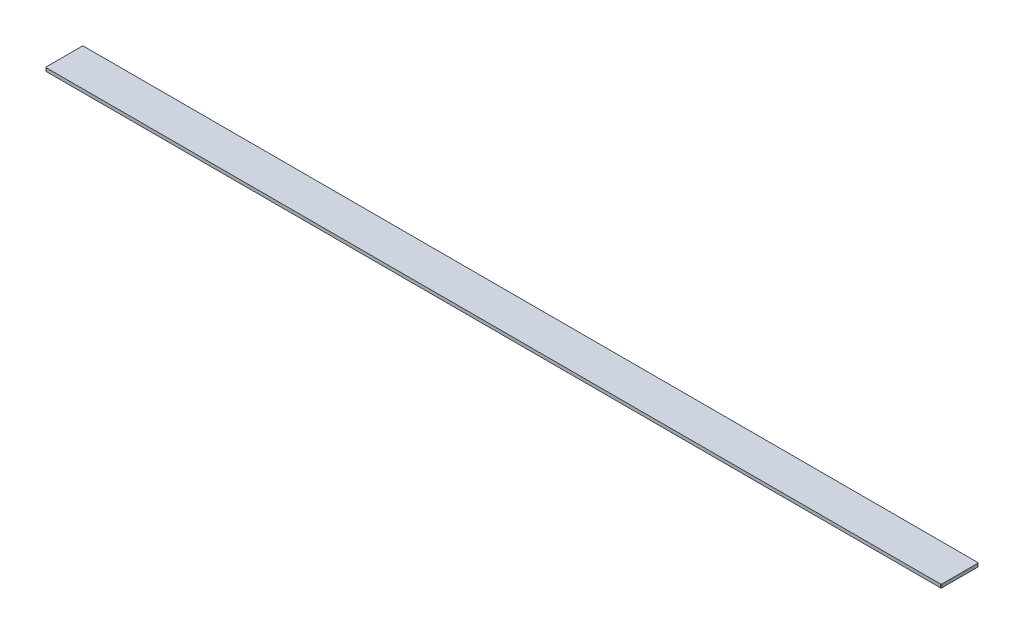
ISO-10303-21;
HEADER;
FILE_DESCRIPTION(('STEP AP214'),'2;1');
FILE_NAME('part.step','',(''),(''),'','','');
FILE_SCHEMA(('AUTOMOTIVE_DESIGN { 1 0 10303 214 1 1 1 1 }'));
ENDSEC;
DATA;
#1=APPLICATION_CONTEXT('core data for automotive mechanical design processes');
#2=APPLICATION_PROTOCOL_DEFINITION('international standard','automotive_design',2000,#1);
#3=PRODUCT_CONTEXT('',#1,'mechanical');
#4=PRODUCT('Part','Part','',(#3));
#5=PRODUCT_RELATED_PRODUCT_CATEGORY('part','',(#4));
#6=PRODUCT_DEFINITION_FORMATION('','',#4);
#7=PRODUCT_DEFINITION_CONTEXT('part definition',#1,'design');
#8=PRODUCT_DEFINITION('design','',#6,#7);
#9=PRODUCT_DEFINITION_SHAPE('','',#8);
#10=(LENGTH_UNIT() NAMED_UNIT(*) SI_UNIT(.MILLI.,.METRE.));
#11=(NAMED_UNIT(*) PLANE_ANGLE_UNIT() SI_UNIT($,.RADIAN.));
#12=(NAMED_UNIT(*) SI_UNIT($,.STERADIAN.) SOLID_ANGLE_UNIT());
#13=UNCERTAINTY_MEASURE_WITH_UNIT(LENGTH_MEASURE(1.E-05),#10,'distance_accuracy_value','');
#14=(GEOMETRIC_REPRESENTATION_CONTEXT(3) GLOBAL_UNCERTAINTY_ASSIGNED_CONTEXT((#13)) GLOBAL_UNIT_ASSIGNED_CONTEXT((#10,
#11,#12)) REPRESENTATION_CONTEXT('',''));
#15=CARTESIAN_POINT('',(0.,0.,0.));
#16=DIRECTION('',(0.,0.,1.));
#17=DIRECTION('',(1.,0.,0.));
#18=AXIS2_PLACEMENT_3D('',#15,#16,#17);
#19=CARTESIAN_POINT('',(-270.,2.,-11.25));
#20=DIRECTION('',(1.,0.,0.));
#21=DIRECTION('',(0.,0.,1.));
#22=AXIS2_PLACEMENT_3D('',#19,#20,#21);
#23=PLANE('',#22);
#24=DIRECTION('',(0.,0.,-1.));
#25=VECTOR('',#24,1.);
#26=CARTESIAN_POINT('',(-270.,2.,-11.25));
#27=LINE('',#26,#25);
#28=CARTESIAN_POINT('',(-270.,2.,10.75));
#29=VERTEX_POINT('',#28);
#30=CARTESIAN_POINT('',(-270.,2.,-10.75));
#31=VERTEX_POINT('',#30);
#32=EDGE_CURVE('E141',#29,#31,#27,.T.);
#33=ORIENTED_EDGE('',*,*,#32,.T.);
#34=DIRECTION('',(0.,-1.,0.));
#35=VECTOR('',#34,1.);
#36=CARTESIAN_POINT('',(-270.,2.,-10.75));
#37=LINE('',#36,#35);
#38=CARTESIAN_POINT('',(-270.,0.,-10.75));
#39=VERTEX_POINT('',#38);
#40=EDGE_CURVE('E125',#39,#31,#37,.F.);
#41=ORIENTED_EDGE('',*,*,#40,.F.);
#42=DIRECTION('',(0.,0.,-1.));
#43=VECTOR('',#42,1.);
#44=CARTESIAN_POINT('',(-270.,0.,-11.25));
#45=LINE('',#44,#43);
#46=CARTESIAN_POINT('',(-270.,0.,10.75));
#47=VERTEX_POINT('',#46);
#48=EDGE_CURVE('E107',#47,#39,#45,.T.);
#49=ORIENTED_EDGE('',*,*,#48,.F.);
#50=DIRECTION('',(0.,-1.,0.));
#51=VECTOR('',#50,1.);
#52=CARTESIAN_POINT('',(-270.,2.,10.75));
#53=LINE('',#52,#51);
#54=EDGE_CURVE('E118',#29,#47,#53,.T.);
#55=ORIENTED_EDGE('',*,*,#54,.F.);
#56=EDGE_LOOP('',(#33,#41,#49,#55));
#57=FACE_BOUND('',#56,.T.);
#58=ADVANCED_FACE('F38',(#57),#23,.F.);
#59=CARTESIAN_POINT('',(270.,2.,-11.25));
#60=DIRECTION('',(0.,0.,1.));
#61=DIRECTION('',(-1.,0.,0.));
#62=AXIS2_PLACEMENT_3D('',#59,#60,#61);
#63=PLANE('',#62);
#64=DIRECTION('',(1.,0.,0.));
#65=VECTOR('',#64,1.);
#66=CARTESIAN_POINT('',(270.,0.,-11.25));
#67=LINE('',#66,#65);
#68=CARTESIAN_POINT('',(-269.5,0.,-11.25));
#69=VERTEX_POINT('',#68);
#70=CARTESIAN_POINT('',(269.5,0.,-11.25));
#71=VERTEX_POINT('',#70);
#72=EDGE_CURVE('E128',#69,#71,#67,.T.);
#73=ORIENTED_EDGE('',*,*,#72,.F.);
#74=DIRECTION('',(0.,-1.,0.));
#75=VECTOR('',#74,1.);
#76=CARTESIAN_POINT('',(-269.5,2.,-11.25));
#77=LINE('',#76,#75);
#78=CARTESIAN_POINT('',(-269.5,2.,-11.25));
#79=VERTEX_POINT('',#78);
#80=EDGE_CURVE('E46',#79,#69,#77,.T.);
#81=ORIENTED_EDGE('',*,*,#80,.F.);
#82=DIRECTION('',(1.,0.,0.));
#83=VECTOR('',#82,1.);
#84=CARTESIAN_POINT('',(270.,2.,-11.25));
#85=LINE('',#84,#83);
#86=CARTESIAN_POINT('',(269.5,2.,-11.25));
#87=VERTEX_POINT('',#86);
#88=EDGE_CURVE('E162',#79,#87,#85,.T.);
#89=ORIENTED_EDGE('',*,*,#88,.T.);
#90=DIRECTION('',(0.,-1.,0.));
#91=VECTOR('',#90,1.);
#92=CARTESIAN_POINT('',(269.5,2.,-11.25));
#93=LINE('',#92,#91);
#94=EDGE_CURVE('E12',#71,#87,#93,.F.);
#95=ORIENTED_EDGE('',*,*,#94,.F.);
#96=EDGE_LOOP('',(#73,#81,#89,#95));
#97=FACE_BOUND('',#96,.T.);
#98=ADVANCED_FACE('F192',(#97),#63,.F.);
#99=CARTESIAN_POINT('',(270.,2.,-11.25));
#100=DIRECTION('',(-1.,0.,0.));
#101=DIRECTION('',(0.,0.,-1.));
#102=AXIS2_PLACEMENT_3D('',#99,#100,#101);
#103=PLANE('',#102);
#104=DIRECTION('',(0.,0.,1.));
#105=VECTOR('',#104,1.);
#106=CARTESIAN_POINT('',(270.,0.,-11.25));
#107=LINE('',#106,#105);
#108=CARTESIAN_POINT('',(270.,0.,-10.75));
#109=VERTEX_POINT('',#108);
#110=CARTESIAN_POINT('',(270.,0.,10.75));
#111=VERTEX_POINT('',#110);
#112=EDGE_CURVE('E131',#109,#111,#107,.T.);
#113=ORIENTED_EDGE('',*,*,#112,.F.);
#114=DIRECTION('',(0.,-1.,0.));
#115=VECTOR('',#114,1.);
#116=CARTESIAN_POINT('',(270.,2.,-10.75));
#117=LINE('',#116,#115);
#118=CARTESIAN_POINT('',(270.,2.,-10.75));
#119=VERTEX_POINT('',#118);
#120=EDGE_CURVE('E177',#119,#109,#117,.T.);
#121=ORIENTED_EDGE('',*,*,#120,.F.);
#122=DIRECTION('',(0.,0.,1.));
#123=VECTOR('',#122,1.);
#124=CARTESIAN_POINT('',(270.,2.,-11.25));
#125=LINE('',#124,#123);
#126=CARTESIAN_POINT('',(270.,2.,10.75));
#127=VERTEX_POINT('',#126);
#128=EDGE_CURVE('E165',#119,#127,#125,.T.);
#129=ORIENTED_EDGE('',*,*,#128,.T.);
#130=DIRECTION('',(0.,-1.,0.));
#131=VECTOR('',#130,1.);
#132=CARTESIAN_POINT('',(270.,2.,10.75));
#133=LINE('',#132,#131);
#134=EDGE_CURVE('E179',#111,#127,#133,.F.);
#135=ORIENTED_EDGE('',*,*,#134,.F.);
#136=EDGE_LOOP('',(#113,#121,#129,#135));
#137=FACE_BOUND('',#136,.T.);
#138=ADVANCED_FACE('F195',(#137),#103,.F.);
#139=CARTESIAN_POINT('',(270.,2.,11.25));
#140=DIRECTION('',(0.,0.,-1.));
#141=DIRECTION('',(1.,0.,0.));
#142=AXIS2_PLACEMENT_3D('',#139,#140,#141);
#143=PLANE('',#142);
#144=DIRECTION('',(-1.,0.,0.));
#145=VECTOR('',#144,1.);
#146=CARTESIAN_POINT('',(270.,0.,11.25));
#147=LINE('',#146,#145);
#148=CARTESIAN_POINT('',(269.5,0.,11.25));
#149=VERTEX_POINT('',#148);
#150=CARTESIAN_POINT('',(-269.5,0.,11.25));
#151=VERTEX_POINT('',#150);
#152=EDGE_CURVE('E110',#149,#151,#147,.T.);
#153=ORIENTED_EDGE('',*,*,#152,.F.);
#154=DIRECTION('',(0.,-1.,0.));
#155=VECTOR('',#154,1.);
#156=CARTESIAN_POINT('',(269.5,2.,11.25));
#157=LINE('',#156,#155);
#158=CARTESIAN_POINT('',(269.5,2.,11.25));
#159=VERTEX_POINT('',#158);
#160=EDGE_CURVE('E114',#159,#149,#157,.T.);
#161=ORIENTED_EDGE('',*,*,#160,.F.);
#162=DIRECTION('',(-1.,0.,0.));
#163=VECTOR('',#162,1.);
#164=CARTESIAN_POINT('',(270.,2.,11.25));
#165=LINE('',#164,#163);
#166=CARTESIAN_POINT('',(-269.5,2.,11.25));
#167=VERTEX_POINT('',#166);
#168=EDGE_CURVE('E134',#159,#167,#165,.T.);
#169=ORIENTED_EDGE('',*,*,#168,.T.);
#170=DIRECTION('',(0.,-1.,0.));
#171=VECTOR('',#170,1.);
#172=CARTESIAN_POINT('',(-269.5,2.,11.25));
#173=LINE('',#172,#171);
#174=EDGE_CURVE('E149',#151,#167,#173,.F.);
#175=ORIENTED_EDGE('',*,*,#174,.F.);
#176=EDGE_LOOP('',(#153,#161,#169,#175));
#177=FACE_BOUND('',#176,.T.);
#178=ADVANCED_FACE('F175',(#177),#143,.F.);
#179=CARTESIAN_POINT('',(0.,2.,0.));
#180=DIRECTION('',(0.,1.,0.));
#181=DIRECTION('',(0.,0.,-1.));
#182=AXIS2_PLACEMENT_3D('',#179,#180,#181);
#183=PLANE('',#182);
#184=ORIENTED_EDGE('',*,*,#168,.F.);
#185=CARTESIAN_POINT('',(269.5,2.,10.75));
#186=DIRECTION('',(0.,-1.,0.));
#187=DIRECTION('',(0.,0.,-1.));
#188=AXIS2_PLACEMENT_3D('',#185,#186,#187);
#189=CIRCLE('',#188,0.5);
#190=EDGE_CURVE('E53',#127,#159,#189,.T.);
#191=ORIENTED_EDGE('',*,*,#190,.F.);
#192=ORIENTED_EDGE('',*,*,#128,.F.);
#193=CARTESIAN_POINT('',(269.5,2.,-10.75));
#194=DIRECTION('',(0.,-1.,0.));
#195=DIRECTION('',(0.,0.,-1.));
#196=AXIS2_PLACEMENT_3D('',#193,#194,#195);
#197=CIRCLE('',#196,0.5);
#198=EDGE_CURVE('E60',#87,#119,#197,.T.);
#199=ORIENTED_EDGE('',*,*,#198,.F.);
#200=ORIENTED_EDGE('',*,*,#88,.F.);
#201=CARTESIAN_POINT('',(-269.5,2.,-10.75));
#202=DIRECTION('',(0.,-1.,0.));
#203=DIRECTION('',(0.,0.,-1.));
#204=AXIS2_PLACEMENT_3D('',#201,#202,#203);
#205=CIRCLE('',#204,0.5);
#206=EDGE_CURVE('E151',#31,#79,#205,.T.);
#207=ORIENTED_EDGE('',*,*,#206,.F.);
#208=ORIENTED_EDGE('',*,*,#32,.F.);
#209=CARTESIAN_POINT('',(-269.5,2.,10.75));
#210=DIRECTION('',(0.,-1.,0.));
#211=DIRECTION('',(0.,0.,-1.));
#212=AXIS2_PLACEMENT_3D('',#209,#210,#211);
#213=CIRCLE('',#212,0.5);
#214=EDGE_CURVE('E120',#167,#29,#213,.T.);
#215=ORIENTED_EDGE('',*,*,#214,.F.);
#216=EDGE_LOOP('',(#184,#191,#192,#199,#200,#207,#208,#215));
#217=FACE_BOUND('',#216,.T.);
#218=ADVANCED_FACE('F176',(#217),#183,.T.);
#219=CARTESIAN_POINT('',(0.,0.,0.));
#220=DIRECTION('',(0.,1.,0.));
#221=DIRECTION('',(0.,0.,-1.));
#222=AXIS2_PLACEMENT_3D('',#219,#220,#221);
#223=PLANE('',#222);
#224=ORIENTED_EDGE('',*,*,#48,.T.);
#225=CARTESIAN_POINT('',(-269.5,0.,-10.75));
#226=DIRECTION('',(0.,-1.,0.));
#227=DIRECTION('',(0.,0.,-1.));
#228=AXIS2_PLACEMENT_3D('',#225,#226,#227);
#229=CIRCLE('',#228,0.5);
#230=EDGE_CURVE('E124',#69,#39,#229,.F.);
#231=ORIENTED_EDGE('',*,*,#230,.F.);
#232=ORIENTED_EDGE('',*,*,#72,.T.);
#233=CARTESIAN_POINT('',(269.5,0.,-10.75));
#234=DIRECTION('',(0.,-1.,0.));
#235=DIRECTION('',(0.,0.,-1.));
#236=AXIS2_PLACEMENT_3D('',#233,#234,#235);
#237=CIRCLE('',#236,0.5);
#238=EDGE_CURVE('E144',#109,#71,#237,.F.);
#239=ORIENTED_EDGE('',*,*,#238,.F.);
#240=ORIENTED_EDGE('',*,*,#112,.T.);
#241=CARTESIAN_POINT('',(269.5,0.,10.75));
#242=DIRECTION('',(0.,-1.,0.));
#243=DIRECTION('',(0.,0.,-1.));
#244=AXIS2_PLACEMENT_3D('',#241,#242,#243);
#245=CIRCLE('',#244,0.5);
#246=EDGE_CURVE('E115',#149,#111,#245,.F.);
#247=ORIENTED_EDGE('',*,*,#246,.F.);
#248=ORIENTED_EDGE('',*,*,#152,.T.);
#249=CARTESIAN_POINT('',(-269.5,0.,10.75));
#250=DIRECTION('',(0.,-1.,0.));
#251=DIRECTION('',(0.,0.,-1.));
#252=AXIS2_PLACEMENT_3D('',#249,#250,#251);
#253=CIRCLE('',#252,0.5);
#254=EDGE_CURVE('E103',#47,#151,#253,.F.);
#255=ORIENTED_EDGE('',*,*,#254,.F.);
#256=EDGE_LOOP('',(#224,#231,#232,#239,#240,#247,#248,#255));
#257=FACE_BOUND('',#256,.T.);
#258=ADVANCED_FACE('F105',(#257),#223,.F.);
#259=CARTESIAN_POINT('',(-269.5,2.,10.75));
#260=DIRECTION('',(0.,-1.,0.));
#261=DIRECTION('',(0.,0.,1.));
#262=AXIS2_PLACEMENT_3D('',#259,#260,#261);
#263=CYLINDRICAL_SURFACE('',#262,0.5);
#264=ORIENTED_EDGE('',*,*,#214,.T.);
#265=ORIENTED_EDGE('',*,*,#54,.T.);
#266=ORIENTED_EDGE('',*,*,#254,.T.);
#267=ORIENTED_EDGE('',*,*,#174,.T.);
#268=EDGE_LOOP('',(#264,#265,#266,#267));
#269=FACE_BOUND('',#268,.T.);
#270=ADVANCED_FACE('F119',(#269),#263,.T.);
#271=CARTESIAN_POINT('',(269.5,2.,10.75));
#272=DIRECTION('',(0.,-1.,0.));
#273=DIRECTION('',(0.,0.,1.));
#274=AXIS2_PLACEMENT_3D('',#271,#272,#273);
#275=CYLINDRICAL_SURFACE('',#274,0.5);
#276=ORIENTED_EDGE('',*,*,#190,.T.);
#277=ORIENTED_EDGE('',*,*,#160,.T.);
#278=ORIENTED_EDGE('',*,*,#246,.T.);
#279=ORIENTED_EDGE('',*,*,#134,.T.);
#280=EDGE_LOOP('',(#276,#277,#278,#279));
#281=FACE_BOUND('',#280,.T.);
#282=ADVANCED_FACE('F197',(#281),#275,.T.);
#283=CARTESIAN_POINT('',(269.5,2.,-10.75));
#284=DIRECTION('',(0.,-1.,0.));
#285=DIRECTION('',(0.,0.,1.));
#286=AXIS2_PLACEMENT_3D('',#283,#284,#285);
#287=CYLINDRICAL_SURFACE('',#286,0.5);
#288=ORIENTED_EDGE('',*,*,#198,.T.);
#289=ORIENTED_EDGE('',*,*,#120,.T.);
#290=ORIENTED_EDGE('',*,*,#238,.T.);
#291=ORIENTED_EDGE('',*,*,#94,.T.);
#292=EDGE_LOOP('',(#288,#289,#290,#291));
#293=FACE_BOUND('',#292,.T.);
#294=ADVANCED_FACE('F194',(#293),#287,.T.);
#295=CARTESIAN_POINT('',(-269.5,2.,-10.75));
#296=DIRECTION('',(0.,-1.,0.));
#297=DIRECTION('',(0.,0.,1.));
#298=AXIS2_PLACEMENT_3D('',#295,#296,#297);
#299=CYLINDRICAL_SURFACE('',#298,0.5);
#300=ORIENTED_EDGE('',*,*,#206,.T.);
#301=ORIENTED_EDGE('',*,*,#80,.T.);
#302=ORIENTED_EDGE('',*,*,#230,.T.);
#303=ORIENTED_EDGE('',*,*,#40,.T.);
#304=EDGE_LOOP('',(#300,#301,#302,#303));
#305=FACE_BOUND('',#304,.T.);
#306=ADVANCED_FACE('F40',(#305),#299,.T.);
#307=CLOSED_SHELL('',(#58,#98,#138,#178,#218,#258,#270,#282,#294,#306));
#308=MANIFOLD_SOLID_BREP('B2',#307);
#309=ADVANCED_BREP_SHAPE_REPRESENTATION('',(#18,#308),#14);
#310=SHAPE_DEFINITION_REPRESENTATION(#9,#309);
ENDSEC;
END-ISO-10303-21;
